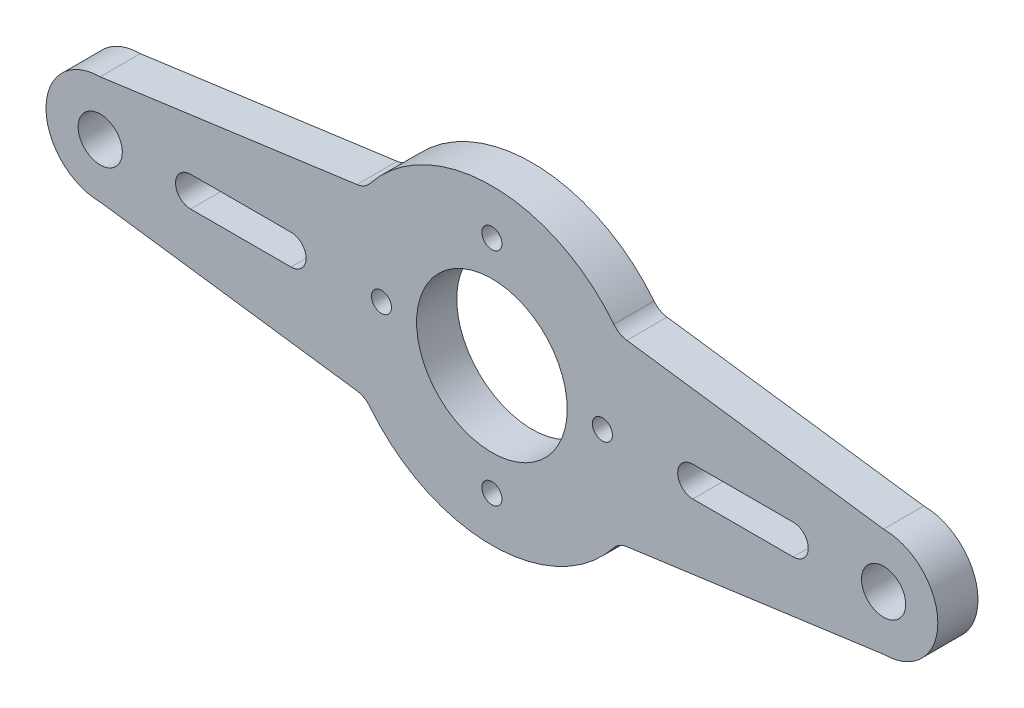
ISO-10303-21;
HEADER;
FILE_DESCRIPTION(('STEP AP214'),'2;1');
FILE_NAME('part.step','',(''),(''),'','','');
FILE_SCHEMA(('AUTOMOTIVE_DESIGN { 1 0 10303 214 1 1 1 1 }'));
ENDSEC;
DATA;
#1=APPLICATION_CONTEXT('core data for automotive mechanical design processes');
#2=APPLICATION_PROTOCOL_DEFINITION('international standard','automotive_design',2000,#1);
#3=PRODUCT_CONTEXT('',#1,'mechanical');
#4=PRODUCT('Part','Part','',(#3));
#5=PRODUCT_RELATED_PRODUCT_CATEGORY('part','',(#4));
#6=PRODUCT_DEFINITION_FORMATION('','',#4);
#7=PRODUCT_DEFINITION_CONTEXT('part definition',#1,'design');
#8=PRODUCT_DEFINITION('design','',#6,#7);
#9=PRODUCT_DEFINITION_SHAPE('','',#8);
#10=(LENGTH_UNIT() NAMED_UNIT(*) SI_UNIT(.MILLI.,.METRE.));
#11=(NAMED_UNIT(*) PLANE_ANGLE_UNIT() SI_UNIT($,.RADIAN.));
#12=(NAMED_UNIT(*) SI_UNIT($,.STERADIAN.) SOLID_ANGLE_UNIT());
#13=UNCERTAINTY_MEASURE_WITH_UNIT(LENGTH_MEASURE(1.E-05),#10,'distance_accuracy_value','');
#14=(GEOMETRIC_REPRESENTATION_CONTEXT(3) GLOBAL_UNCERTAINTY_ASSIGNED_CONTEXT((#13)) GLOBAL_UNIT_ASSIGNED_CONTEXT((#10,
#11,#12)) REPRESENTATION_CONTEXT('',''));
#15=CARTESIAN_POINT('',(0.,0.,0.));
#16=DIRECTION('',(0.,0.,1.));
#17=DIRECTION('',(1.,0.,0.));
#18=AXIS2_PLACEMENT_3D('',#15,#16,#17);
#19=CARTESIAN_POINT('',(-19.5,0.,2.));
#20=DIRECTION('',(0.,0.,1.));
#21=DIRECTION('',(1.,0.,0.));
#22=AXIS2_PLACEMENT_3D('',#19,#20,#21);
#23=PLANE('',#22);
#24=CARTESIAN_POINT('',(0.,5.5,2.));
#25=DIRECTION('',(0.,0.,1.));
#26=DIRECTION('',(1.,0.,0.));
#27=AXIS2_PLACEMENT_3D('',#24,#25,#26);
#28=CIRCLE('',#27,0.5);
#29=CARTESIAN_POINT('',(0.5,5.5,2.));
#30=VERTEX_POINT('',#29);
#31=EDGE_CURVE('E699',#30,#30,#28,.T.);
#32=ORIENTED_EDGE('',*,*,#31,.F.);
#33=EDGE_LOOP('',(#32));
#34=FACE_BOUND('',#33,.T.);
#35=CARTESIAN_POINT('',(5.5,0.,2.));
#36=DIRECTION('',(0.,0.,1.));
#37=DIRECTION('',(1.,0.,0.));
#38=AXIS2_PLACEMENT_3D('',#35,#36,#37);
#39=CIRCLE('',#38,0.5);
#40=CARTESIAN_POINT('',(6.,0.,2.));
#41=VERTEX_POINT('',#40);
#42=EDGE_CURVE('E693',#41,#41,#39,.T.);
#43=ORIENTED_EDGE('',*,*,#42,.F.);
#44=EDGE_LOOP('',(#43));
#45=FACE_BOUND('',#44,.T.);
#46=CARTESIAN_POINT('',(0.,-5.5,2.));
#47=DIRECTION('',(0.,0.,1.));
#48=DIRECTION('',(1.,0.,0.));
#49=AXIS2_PLACEMENT_3D('',#46,#47,#48);
#50=CIRCLE('',#49,0.5);
#51=CARTESIAN_POINT('',(0.5,-5.5,2.));
#52=VERTEX_POINT('',#51);
#53=EDGE_CURVE('E687',#52,#52,#50,.T.);
#54=ORIENTED_EDGE('',*,*,#53,.F.);
#55=EDGE_LOOP('',(#54));
#56=FACE_BOUND('',#55,.T.);
#57=CARTESIAN_POINT('',(-5.5,0.,2.));
#58=DIRECTION('',(0.,0.,1.));
#59=DIRECTION('',(1.,0.,0.));
#60=AXIS2_PLACEMENT_3D('',#57,#58,#59);
#61=CIRCLE('',#60,0.5);
#62=CARTESIAN_POINT('',(-5.,0.,2.));
#63=VERTEX_POINT('',#62);
#64=EDGE_CURVE('E674',#63,#63,#61,.T.);
#65=ORIENTED_EDGE('',*,*,#64,.F.);
#66=EDGE_LOOP('',(#65));
#67=FACE_BOUND('',#66,.T.);
#68=CARTESIAN_POINT('',(19.5,0.,2.));
#69=DIRECTION('',(0.,0.,1.));
#70=DIRECTION('',(-1.,0.,0.));
#71=AXIS2_PLACEMENT_3D('',#68,#69,#70);
#72=CIRCLE('',#71,1.1);
#73=CARTESIAN_POINT('',(18.4,0.,2.));
#74=VERTEX_POINT('',#73);
#75=EDGE_CURVE('E215',#74,#74,#72,.T.);
#76=ORIENTED_EDGE('',*,*,#75,.F.);
#77=EDGE_LOOP('',(#76));
#78=FACE_BOUND('',#77,.T.);
#79=CARTESIAN_POINT('',(-19.5,0.,2.));
#80=DIRECTION('',(0.,0.,1.));
#81=DIRECTION('',(1.,0.,0.));
#82=AXIS2_PLACEMENT_3D('',#79,#80,#81);
#83=CIRCLE('',#82,2.7);
#84=CARTESIAN_POINT('',(-19.5,2.7,2.));
#85=VERTEX_POINT('',#84);
#86=CARTESIAN_POINT('',(-19.5,-2.7,2.));
#87=VERTEX_POINT('',#86);
#88=EDGE_CURVE('E263',#85,#87,#83,.T.);
#89=ORIENTED_EDGE('',*,*,#88,.T.);
#90=DIRECTION('',(0.990771512217223,-0.135542652249383,0.));
#91=VECTOR('',#90,1.);
#92=CARTESIAN_POINT('',(-19.5,-2.7,2.));
#93=LINE('',#92,#91);
#94=CARTESIAN_POINT('',(-6.71834513514588,-4.44859630011115,2.));
#95=VERTEX_POINT('',#94);
#96=EDGE_CURVE('E266',#87,#95,#93,.T.);
#97=ORIENTED_EDGE('',*,*,#96,.T.);
#98=CARTESIAN_POINT('',(-6.85388778739526,-5.43936781232837,2.));
#99=DIRECTION('',(0.,0.,1.));
#100=DIRECTION('',(1.,0.,0.));
#101=AXIS2_PLACEMENT_3D('',#98,#99,#100);
#102=CIRCLE('',#101,1.);
#103=CARTESIAN_POINT('',(-6.07058632597866,-4.8177257766337,2.));
#104=VERTEX_POINT('',#103);
#105=EDGE_CURVE('E339',#95,#104,#102,.F.);
#106=ORIENTED_EDGE('',*,*,#105,.T.);
#107=CARTESIAN_POINT('',(0.,0.,2.));
#108=DIRECTION('',(0.,0.,1.));
#109=DIRECTION('',(1.,0.,0.));
#110=AXIS2_PLACEMENT_3D('',#107,#108,#109);
#111=CIRCLE('',#110,7.74999999999999);
#112=CARTESIAN_POINT('',(6.07058632597867,-4.8177257766337,2.));
#113=VERTEX_POINT('',#112);
#114=EDGE_CURVE('E270',#104,#113,#111,.T.);
#115=ORIENTED_EDGE('',*,*,#114,.T.);
#116=CARTESIAN_POINT('',(6.85388778739527,-5.43936781232837,2.));
#117=DIRECTION('',(0.,0.,1.));
#118=DIRECTION('',(1.,0.,0.));
#119=AXIS2_PLACEMENT_3D('',#116,#117,#118);
#120=CIRCLE('',#119,1.);
#121=CARTESIAN_POINT('',(6.71834513514589,-4.44859630011114,2.));
#122=VERTEX_POINT('',#121);
#123=EDGE_CURVE('E343',#113,#122,#120,.F.);
#124=ORIENTED_EDGE('',*,*,#123,.T.);
#125=DIRECTION('',(0.990771512217223,0.135542652249383,0.));
#126=VECTOR('',#125,1.);
#127=CARTESIAN_POINT('',(19.5,-2.7,2.));
#128=LINE('',#127,#126);
#129=CARTESIAN_POINT('',(19.5,-2.69999999999999,2.));
#130=VERTEX_POINT('',#129);
#131=EDGE_CURVE('E273',#122,#130,#128,.T.);
#132=ORIENTED_EDGE('',*,*,#131,.T.);
#133=CARTESIAN_POINT('',(19.5,0.,2.));
#134=DIRECTION('',(0.,0.,1.));
#135=DIRECTION('',(-1.,0.,0.));
#136=AXIS2_PLACEMENT_3D('',#133,#134,#135);
#137=CIRCLE('',#136,2.7);
#138=CARTESIAN_POINT('',(19.5,2.7,2.));
#139=VERTEX_POINT('',#138);
#140=EDGE_CURVE('E275',#130,#139,#137,.T.);
#141=ORIENTED_EDGE('',*,*,#140,.T.);
#142=DIRECTION('',(-0.990771512217223,0.135542652249384,0.));
#143=VECTOR('',#142,1.);
#144=CARTESIAN_POINT('',(19.5,2.7,2.));
#145=LINE('',#144,#143);
#146=CARTESIAN_POINT('',(6.71834513514589,4.44859630011115,2.));
#147=VERTEX_POINT('',#146);
#148=EDGE_CURVE('E277',#139,#147,#145,.T.);
#149=ORIENTED_EDGE('',*,*,#148,.T.);
#150=CARTESIAN_POINT('',(6.85388778739527,5.43936781232837,2.));
#151=DIRECTION('',(0.,0.,1.));
#152=DIRECTION('',(1.,0.,0.));
#153=AXIS2_PLACEMENT_3D('',#150,#151,#152);
#154=CIRCLE('',#153,1.);
#155=CARTESIAN_POINT('',(6.07058632597866,4.8177257766337,2.));
#156=VERTEX_POINT('',#155);
#157=EDGE_CURVE('E13',#147,#156,#154,.F.);
#158=ORIENTED_EDGE('',*,*,#157,.T.);
#159=CARTESIAN_POINT('',(0.,0.,2.));
#160=DIRECTION('',(0.,0.,1.));
#161=DIRECTION('',(1.,0.,0.));
#162=AXIS2_PLACEMENT_3D('',#159,#160,#161);
#163=CIRCLE('',#162,7.75);
#164=CARTESIAN_POINT('',(-6.07058632597866,4.81772577663371,2.));
#165=VERTEX_POINT('',#164);
#166=EDGE_CURVE('E279',#156,#165,#163,.T.);
#167=ORIENTED_EDGE('',*,*,#166,.T.);
#168=CARTESIAN_POINT('',(-6.85388778739526,5.43936781232838,2.));
#169=DIRECTION('',(0.,0.,1.));
#170=DIRECTION('',(1.,0.,0.));
#171=AXIS2_PLACEMENT_3D('',#168,#169,#170);
#172=CIRCLE('',#171,1.);
#173=CARTESIAN_POINT('',(-6.71834513514588,4.44859630011115,2.));
#174=VERTEX_POINT('',#173);
#175=EDGE_CURVE('E335',#165,#174,#172,.F.);
#176=ORIENTED_EDGE('',*,*,#175,.T.);
#177=DIRECTION('',(-0.990771512217223,-0.135542652249384,0.));
#178=VECTOR('',#177,1.);
#179=CARTESIAN_POINT('',(-19.5,2.7,2.));
#180=LINE('',#179,#178);
#181=EDGE_CURVE('E282',#174,#85,#180,.T.);
#182=ORIENTED_EDGE('',*,*,#181,.T.);
#183=EDGE_LOOP('',(#89,#97,#106,#115,#124,#132,#141,#149,#158,#167,#176,#182));
#184=FACE_BOUND('',#183,.T.);
#185=CARTESIAN_POINT('',(-19.5,0.,2.));
#186=DIRECTION('',(0.,0.,1.));
#187=DIRECTION('',(1.,0.,0.));
#188=AXIS2_PLACEMENT_3D('',#185,#186,#187);
#189=CIRCLE('',#188,1.1);
#190=CARTESIAN_POINT('',(-18.4,0.,2.));
#191=VERTEX_POINT('',#190);
#192=EDGE_CURVE('E257',#191,#191,#189,.T.);
#193=ORIENTED_EDGE('',*,*,#192,.F.);
#194=EDGE_LOOP('',(#193));
#195=FACE_BOUND('',#194,.T.);
#196=DIRECTION('',(-1.,0.,0.));
#197=VECTOR('',#196,1.);
#198=CARTESIAN_POINT('',(-10.,0.749999999999999,2.));
#199=LINE('',#198,#197);
#200=CARTESIAN_POINT('',(-10.,0.749999999999999,2.));
#201=VERTEX_POINT('',#200);
#202=CARTESIAN_POINT('',(-15.,0.75,2.));
#203=VERTEX_POINT('',#202);
#204=EDGE_CURVE('E228',#201,#203,#199,.T.);
#205=ORIENTED_EDGE('',*,*,#204,.F.);
#206=CARTESIAN_POINT('',(-10.,0.,2.));
#207=DIRECTION('',(0.,0.,1.));
#208=DIRECTION('',(1.,0.,0.));
#209=AXIS2_PLACEMENT_3D('',#206,#207,#208);
#210=CIRCLE('',#209,0.75);
#211=CARTESIAN_POINT('',(-10.,-0.750000000000001,2.));
#212=VERTEX_POINT('',#211);
#213=EDGE_CURVE('E226',#212,#201,#210,.T.);
#214=ORIENTED_EDGE('',*,*,#213,.F.);
#215=DIRECTION('',(1.,0.,0.));
#216=VECTOR('',#215,1.);
#217=CARTESIAN_POINT('',(-10.,-0.750000000000001,2.));
#218=LINE('',#217,#216);
#219=CARTESIAN_POINT('',(-15.,-0.750000000000001,2.));
#220=VERTEX_POINT('',#219);
#221=EDGE_CURVE('E234',#220,#212,#218,.T.);
#222=ORIENTED_EDGE('',*,*,#221,.F.);
#223=CARTESIAN_POINT('',(-15.,0.,2.));
#224=DIRECTION('',(0.,0.,1.));
#225=DIRECTION('',(1.,0.,0.));
#226=AXIS2_PLACEMENT_3D('',#223,#224,#225);
#227=CIRCLE('',#226,0.75);
#228=EDGE_CURVE('E231',#203,#220,#227,.T.);
#229=ORIENTED_EDGE('',*,*,#228,.F.);
#230=EDGE_LOOP('',(#205,#214,#222,#229));
#231=FACE_BOUND('',#230,.T.);
#232=DIRECTION('',(1.,0.,0.));
#233=VECTOR('',#232,1.);
#234=CARTESIAN_POINT('',(10.,-0.750000000000001,2.));
#235=LINE('',#234,#233);
#236=CARTESIAN_POINT('',(10.,-0.750000000000001,2.));
#237=VERTEX_POINT('',#236);
#238=CARTESIAN_POINT('',(15.,-0.75,2.));
#239=VERTEX_POINT('',#238);
#240=EDGE_CURVE('E192',#237,#239,#235,.T.);
#241=ORIENTED_EDGE('',*,*,#240,.F.);
#242=CARTESIAN_POINT('',(10.,0.,2.));
#243=DIRECTION('',(0.,0.,1.));
#244=DIRECTION('',(-1.,0.,0.));
#245=AXIS2_PLACEMENT_3D('',#242,#243,#244);
#246=CIRCLE('',#245,0.75);
#247=CARTESIAN_POINT('',(10.,0.749999999999998,2.));
#248=VERTEX_POINT('',#247);
#249=EDGE_CURVE('E182',#248,#237,#246,.T.);
#250=ORIENTED_EDGE('',*,*,#249,.F.);
#251=DIRECTION('',(-1.,0.,0.));
#252=VECTOR('',#251,1.);
#253=CARTESIAN_POINT('',(10.,0.749999999999998,2.));
#254=LINE('',#253,#252);
#255=CARTESIAN_POINT('',(15.,0.749999999999999,2.));
#256=VERTEX_POINT('',#255);
#257=EDGE_CURVE('E208',#256,#248,#254,.T.);
#258=ORIENTED_EDGE('',*,*,#257,.F.);
#259=CARTESIAN_POINT('',(15.,0.,2.));
#260=DIRECTION('',(0.,0.,1.));
#261=DIRECTION('',(-1.,0.,0.));
#262=AXIS2_PLACEMENT_3D('',#259,#260,#261);
#263=CIRCLE('',#262,0.75);
#264=EDGE_CURVE('E206',#239,#256,#263,.T.);
#265=ORIENTED_EDGE('',*,*,#264,.F.);
#266=EDGE_LOOP('',(#241,#250,#258,#265));
#267=FACE_BOUND('',#266,.T.);
#268=CARTESIAN_POINT('',(0.,0.,2.));
#269=DIRECTION('',(0.,0.,1.));
#270=DIRECTION('',(1.,0.,0.));
#271=AXIS2_PLACEMENT_3D('',#268,#269,#270);
#272=CIRCLE('',#271,3.75);
#273=CARTESIAN_POINT('',(3.75,0.,2.));
#274=VERTEX_POINT('',#273);
#275=EDGE_CURVE('E668',#274,#274,#272,.T.);
#276=ORIENTED_EDGE('',*,*,#275,.F.);
#277=EDGE_LOOP('',(#276));
#278=FACE_BOUND('',#277,.T.);
#279=ADVANCED_FACE('F44',(#34,#45,#56,#67,#78,#184,#195,#231,#267,#278),#23,.T.);
#280=CARTESIAN_POINT('',(-19.5,0.,0.));
#281=DIRECTION('',(0.,0.,1.));
#282=DIRECTION('',(1.,0.,0.));
#283=AXIS2_PLACEMENT_3D('',#280,#281,#282);
#284=PLANE('',#283);
#285=CARTESIAN_POINT('',(0.,5.5,0.));
#286=DIRECTION('',(0.,0.,1.));
#287=DIRECTION('',(1.,0.,0.));
#288=AXIS2_PLACEMENT_3D('',#285,#286,#287);
#289=CIRCLE('',#288,0.5);
#290=CARTESIAN_POINT('',(0.5,5.5,0.));
#291=VERTEX_POINT('',#290);
#292=EDGE_CURVE('E696',#291,#291,#289,.T.);
#293=ORIENTED_EDGE('',*,*,#292,.T.);
#294=EDGE_LOOP('',(#293));
#295=FACE_BOUND('',#294,.T.);
#296=CARTESIAN_POINT('',(5.5,0.,0.));
#297=DIRECTION('',(0.,0.,1.));
#298=DIRECTION('',(1.,0.,0.));
#299=AXIS2_PLACEMENT_3D('',#296,#297,#298);
#300=CIRCLE('',#299,0.5);
#301=CARTESIAN_POINT('',(6.,0.,0.));
#302=VERTEX_POINT('',#301);
#303=EDGE_CURVE('E690',#302,#302,#300,.T.);
#304=ORIENTED_EDGE('',*,*,#303,.T.);
#305=EDGE_LOOP('',(#304));
#306=FACE_BOUND('',#305,.T.);
#307=CARTESIAN_POINT('',(0.,-5.5,0.));
#308=DIRECTION('',(0.,0.,1.));
#309=DIRECTION('',(1.,0.,0.));
#310=AXIS2_PLACEMENT_3D('',#307,#308,#309);
#311=CIRCLE('',#310,0.5);
#312=CARTESIAN_POINT('',(0.5,-5.5,0.));
#313=VERTEX_POINT('',#312);
#314=EDGE_CURVE('E684',#313,#313,#311,.T.);
#315=ORIENTED_EDGE('',*,*,#314,.T.);
#316=EDGE_LOOP('',(#315));
#317=FACE_BOUND('',#316,.T.);
#318=CARTESIAN_POINT('',(-5.5,0.,0.));
#319=DIRECTION('',(0.,0.,1.));
#320=DIRECTION('',(1.,0.,0.));
#321=AXIS2_PLACEMENT_3D('',#318,#319,#320);
#322=CIRCLE('',#321,0.5);
#323=CARTESIAN_POINT('',(-5.,0.,0.));
#324=VERTEX_POINT('',#323);
#325=EDGE_CURVE('E669',#324,#324,#322,.T.);
#326=ORIENTED_EDGE('',*,*,#325,.T.);
#327=EDGE_LOOP('',(#326));
#328=FACE_BOUND('',#327,.T.);
#329=CARTESIAN_POINT('',(-10.,0.,0.));
#330=DIRECTION('',(0.,0.,1.));
#331=DIRECTION('',(1.,0.,0.));
#332=AXIS2_PLACEMENT_3D('',#329,#330,#331);
#333=CIRCLE('',#332,0.75);
#334=CARTESIAN_POINT('',(-10.,-0.750000000000001,0.));
#335=VERTEX_POINT('',#334);
#336=CARTESIAN_POINT('',(-10.,0.749999999999999,0.));
#337=VERTEX_POINT('',#336);
#338=EDGE_CURVE('E200',#335,#337,#333,.T.);
#339=ORIENTED_EDGE('',*,*,#338,.T.);
#340=DIRECTION('',(-1.,0.,0.));
#341=VECTOR('',#340,1.);
#342=CARTESIAN_POINT('',(-10.,0.749999999999999,0.));
#343=LINE('',#342,#341);
#344=CARTESIAN_POINT('',(-15.,0.75,0.));
#345=VERTEX_POINT('',#344);
#346=EDGE_CURVE('E239',#337,#345,#343,.T.);
#347=ORIENTED_EDGE('',*,*,#346,.T.);
#348=CARTESIAN_POINT('',(-15.,0.,0.));
#349=DIRECTION('',(0.,0.,1.));
#350=DIRECTION('',(1.,0.,0.));
#351=AXIS2_PLACEMENT_3D('',#348,#349,#350);
#352=CIRCLE('',#351,0.75);
#353=CARTESIAN_POINT('',(-15.,-0.750000000000001,0.));
#354=VERTEX_POINT('',#353);
#355=EDGE_CURVE('E242',#345,#354,#352,.T.);
#356=ORIENTED_EDGE('',*,*,#355,.T.);
#357=DIRECTION('',(1.,0.,0.));
#358=VECTOR('',#357,1.);
#359=CARTESIAN_POINT('',(-10.,-0.750000000000001,0.));
#360=LINE('',#359,#358);
#361=EDGE_CURVE('E229',#354,#335,#360,.T.);
#362=ORIENTED_EDGE('',*,*,#361,.T.);
#363=EDGE_LOOP('',(#339,#347,#356,#362));
#364=FACE_BOUND('',#363,.T.);
#365=CARTESIAN_POINT('',(-19.5,0.,0.));
#366=DIRECTION('',(0.,0.,1.));
#367=DIRECTION('',(1.,0.,0.));
#368=AXIS2_PLACEMENT_3D('',#365,#366,#367);
#369=CIRCLE('',#368,2.7);
#370=CARTESIAN_POINT('',(-19.5,2.7,0.));
#371=VERTEX_POINT('',#370);
#372=CARTESIAN_POINT('',(-19.5,-2.7,0.));
#373=VERTEX_POINT('',#372);
#374=EDGE_CURVE('E260',#371,#373,#369,.T.);
#375=ORIENTED_EDGE('',*,*,#374,.F.);
#376=DIRECTION('',(-0.990771512217223,-0.135542652249384,0.));
#377=VECTOR('',#376,1.);
#378=CARTESIAN_POINT('',(-19.5,2.7,0.));
#379=LINE('',#378,#377);
#380=CARTESIAN_POINT('',(-6.71834513514588,4.44859630011115,0.));
#381=VERTEX_POINT('',#380);
#382=EDGE_CURVE('E267',#381,#371,#379,.T.);
#383=ORIENTED_EDGE('',*,*,#382,.F.);
#384=CARTESIAN_POINT('',(-6.85388778739526,5.43936781232838,0.));
#385=DIRECTION('',(0.,0.,1.));
#386=DIRECTION('',(1.,0.,0.));
#387=AXIS2_PLACEMENT_3D('',#384,#385,#386);
#388=CIRCLE('',#387,1.);
#389=CARTESIAN_POINT('',(-6.07058632597866,4.81772577663371,0.));
#390=VERTEX_POINT('',#389);
#391=EDGE_CURVE('E333',#381,#390,#388,.T.);
#392=ORIENTED_EDGE('',*,*,#391,.T.);
#393=CARTESIAN_POINT('',(0.,0.,0.));
#394=DIRECTION('',(0.,0.,1.));
#395=DIRECTION('',(1.,0.,0.));
#396=AXIS2_PLACEMENT_3D('',#393,#394,#395);
#397=CIRCLE('',#396,7.75);
#398=CARTESIAN_POINT('',(6.07058632597866,4.8177257766337,0.));
#399=VERTEX_POINT('',#398);
#400=EDGE_CURVE('E299',#399,#390,#397,.T.);
#401=ORIENTED_EDGE('',*,*,#400,.F.);
#402=CARTESIAN_POINT('',(6.85388778739527,5.43936781232837,0.));
#403=DIRECTION('',(0.,0.,1.));
#404=DIRECTION('',(1.,0.,0.));
#405=AXIS2_PLACEMENT_3D('',#402,#403,#404);
#406=CIRCLE('',#405,1.);
#407=CARTESIAN_POINT('',(6.71834513514589,4.44859630011115,0.));
#408=VERTEX_POINT('',#407);
#409=EDGE_CURVE('E52',#399,#408,#406,.T.);
#410=ORIENTED_EDGE('',*,*,#409,.T.);
#411=DIRECTION('',(-0.990771512217223,0.135542652249384,0.));
#412=VECTOR('',#411,1.);
#413=CARTESIAN_POINT('',(19.5,2.7,0.));
#414=LINE('',#413,#412);
#415=CARTESIAN_POINT('',(19.5,2.7,0.));
#416=VERTEX_POINT('',#415);
#417=EDGE_CURVE('E297',#416,#408,#414,.T.);
#418=ORIENTED_EDGE('',*,*,#417,.F.);
#419=CARTESIAN_POINT('',(19.5,0.,0.));
#420=DIRECTION('',(0.,0.,1.));
#421=DIRECTION('',(-1.,0.,0.));
#422=AXIS2_PLACEMENT_3D('',#419,#420,#421);
#423=CIRCLE('',#422,2.7);
#424=CARTESIAN_POINT('',(19.5,-2.69999999999999,0.));
#425=VERTEX_POINT('',#424);
#426=EDGE_CURVE('E295',#425,#416,#423,.T.);
#427=ORIENTED_EDGE('',*,*,#426,.F.);
#428=DIRECTION('',(0.990771512217223,0.135542652249383,0.));
#429=VECTOR('',#428,1.);
#430=CARTESIAN_POINT('',(19.5,-2.7,0.));
#431=LINE('',#430,#429);
#432=CARTESIAN_POINT('',(6.71834513514589,-4.44859630011114,0.));
#433=VERTEX_POINT('',#432);
#434=EDGE_CURVE('E293',#433,#425,#431,.T.);
#435=ORIENTED_EDGE('',*,*,#434,.F.);
#436=CARTESIAN_POINT('',(6.85388778739527,-5.43936781232837,0.));
#437=DIRECTION('',(0.,0.,1.));
#438=DIRECTION('',(1.,0.,0.));
#439=AXIS2_PLACEMENT_3D('',#436,#437,#438);
#440=CIRCLE('',#439,1.);
#441=CARTESIAN_POINT('',(6.07058632597867,-4.8177257766337,0.));
#442=VERTEX_POINT('',#441);
#443=EDGE_CURVE('E341',#433,#442,#440,.T.);
#444=ORIENTED_EDGE('',*,*,#443,.T.);
#445=CARTESIAN_POINT('',(0.,0.,0.));
#446=DIRECTION('',(0.,0.,1.));
#447=DIRECTION('',(1.,0.,0.));
#448=AXIS2_PLACEMENT_3D('',#445,#446,#447);
#449=CIRCLE('',#448,7.74999999999999);
#450=CARTESIAN_POINT('',(-6.07058632597866,-4.8177257766337,0.));
#451=VERTEX_POINT('',#450);
#452=EDGE_CURVE('E290',#451,#442,#449,.T.);
#453=ORIENTED_EDGE('',*,*,#452,.F.);
#454=CARTESIAN_POINT('',(-6.85388778739526,-5.43936781232837,0.));
#455=DIRECTION('',(0.,0.,1.));
#456=DIRECTION('',(1.,0.,0.));
#457=AXIS2_PLACEMENT_3D('',#454,#455,#456);
#458=CIRCLE('',#457,1.);
#459=CARTESIAN_POINT('',(-6.71834513514588,-4.44859630011115,0.));
#460=VERTEX_POINT('',#459);
#461=EDGE_CURVE('E337',#451,#460,#458,.T.);
#462=ORIENTED_EDGE('',*,*,#461,.T.);
#463=DIRECTION('',(0.990771512217223,-0.135542652249383,0.));
#464=VECTOR('',#463,1.);
#465=CARTESIAN_POINT('',(-19.5,-2.7,0.));
#466=LINE('',#465,#464);
#467=EDGE_CURVE('E287',#373,#460,#466,.T.);
#468=ORIENTED_EDGE('',*,*,#467,.F.);
#469=EDGE_LOOP('',(#375,#383,#392,#401,#410,#418,#427,#435,#444,#453,#462,#468));
#470=FACE_BOUND('',#469,.T.);
#471=CARTESIAN_POINT('',(-19.5,0.,0.));
#472=DIRECTION('',(0.,0.,1.));
#473=DIRECTION('',(1.,0.,0.));
#474=AXIS2_PLACEMENT_3D('',#471,#472,#473);
#475=CIRCLE('',#474,1.1);
#476=CARTESIAN_POINT('',(-18.4,0.,0.));
#477=VERTEX_POINT('',#476);
#478=EDGE_CURVE('E256',#477,#477,#475,.T.);
#479=ORIENTED_EDGE('',*,*,#478,.T.);
#480=EDGE_LOOP('',(#479));
#481=FACE_BOUND('',#480,.T.);
#482=CARTESIAN_POINT('',(10.,0.,0.));
#483=DIRECTION('',(0.,0.,1.));
#484=DIRECTION('',(-1.,0.,0.));
#485=AXIS2_PLACEMENT_3D('',#482,#483,#484);
#486=CIRCLE('',#485,0.75);
#487=CARTESIAN_POINT('',(10.,0.749999999999998,0.));
#488=VERTEX_POINT('',#487);
#489=CARTESIAN_POINT('',(10.,-0.750000000000001,0.));
#490=VERTEX_POINT('',#489);
#491=EDGE_CURVE('E213',#488,#490,#486,.T.);
#492=ORIENTED_EDGE('',*,*,#491,.T.);
#493=DIRECTION('',(1.,0.,0.));
#494=VECTOR('',#493,1.);
#495=CARTESIAN_POINT('',(10.,-0.750000000000001,0.));
#496=LINE('',#495,#494);
#497=CARTESIAN_POINT('',(15.,-0.75,0.));
#498=VERTEX_POINT('',#497);
#499=EDGE_CURVE('E199',#490,#498,#496,.T.);
#500=ORIENTED_EDGE('',*,*,#499,.T.);
#501=CARTESIAN_POINT('',(15.,0.,0.));
#502=DIRECTION('',(0.,0.,1.));
#503=DIRECTION('',(-1.,0.,0.));
#504=AXIS2_PLACEMENT_3D('',#501,#502,#503);
#505=CIRCLE('',#504,0.75);
#506=CARTESIAN_POINT('',(15.,0.749999999999999,0.));
#507=VERTEX_POINT('',#506);
#508=EDGE_CURVE('E217',#498,#507,#505,.T.);
#509=ORIENTED_EDGE('',*,*,#508,.T.);
#510=DIRECTION('',(-1.,0.,0.));
#511=VECTOR('',#510,1.);
#512=CARTESIAN_POINT('',(10.,0.749999999999998,0.));
#513=LINE('',#512,#511);
#514=EDGE_CURVE('E193',#507,#488,#513,.T.);
#515=ORIENTED_EDGE('',*,*,#514,.T.);
#516=EDGE_LOOP('',(#492,#500,#509,#515));
#517=FACE_BOUND('',#516,.T.);
#518=CARTESIAN_POINT('',(19.5,0.,0.));
#519=DIRECTION('',(0.,0.,1.));
#520=DIRECTION('',(-1.,0.,0.));
#521=AXIS2_PLACEMENT_3D('',#518,#519,#520);
#522=CIRCLE('',#521,1.1);
#523=CARTESIAN_POINT('',(18.4,0.,0.));
#524=VERTEX_POINT('',#523);
#525=EDGE_CURVE('E663',#524,#524,#522,.T.);
#526=ORIENTED_EDGE('',*,*,#525,.T.);
#527=EDGE_LOOP('',(#526));
#528=FACE_BOUND('',#527,.T.);
#529=CARTESIAN_POINT('',(0.,0.,0.));
#530=DIRECTION('',(0.,0.,1.));
#531=DIRECTION('',(1.,0.,0.));
#532=AXIS2_PLACEMENT_3D('',#529,#530,#531);
#533=CIRCLE('',#532,3.75);
#534=CARTESIAN_POINT('',(3.75,0.,0.));
#535=VERTEX_POINT('',#534);
#536=EDGE_CURVE('E666',#535,#535,#533,.T.);
#537=ORIENTED_EDGE('',*,*,#536,.T.);
#538=EDGE_LOOP('',(#537));
#539=FACE_BOUND('',#538,.T.);
#540=ADVANCED_FACE('F360',(#295,#306,#317,#328,#364,#470,#481,#517,#528,#539),#284,.F.);
#541=CARTESIAN_POINT('',(-19.5,0.,2.));
#542=DIRECTION('',(0.,0.,-1.));
#543=DIRECTION('',(-1.,0.,0.));
#544=AXIS2_PLACEMENT_3D('',#541,#542,#543);
#545=CYLINDRICAL_SURFACE('',#544,2.7);
#546=ORIENTED_EDGE('',*,*,#374,.T.);
#547=DIRECTION('',(0.,0.,-1.));
#548=VECTOR('',#547,1.);
#549=CARTESIAN_POINT('',(-19.5,-2.7,2.));
#550=LINE('',#549,#548);
#551=EDGE_CURVE('E311',#87,#373,#550,.T.);
#552=ORIENTED_EDGE('',*,*,#551,.F.);
#553=ORIENTED_EDGE('',*,*,#88,.F.);
#554=DIRECTION('',(0.,0.,-1.));
#555=VECTOR('',#554,1.);
#556=CARTESIAN_POINT('',(-19.5,2.7,2.));
#557=LINE('',#556,#555);
#558=EDGE_CURVE('E284',#85,#371,#557,.T.);
#559=ORIENTED_EDGE('',*,*,#558,.T.);
#560=EDGE_LOOP('',(#546,#552,#553,#559));
#561=FACE_BOUND('',#560,.T.);
#562=ADVANCED_FACE('F375',(#561),#545,.T.);
#563=CARTESIAN_POINT('',(-19.5,-2.7,2.));
#564=DIRECTION('',(0.135542652249383,0.990771512217223,0.));
#565=DIRECTION('',(-0.990771512217223,0.135542652249383,0.));
#566=AXIS2_PLACEMENT_3D('',#563,#564,#565);
#567=PLANE('',#566);
#568=ORIENTED_EDGE('',*,*,#467,.T.);
#569=DIRECTION('',(0.,0.,1.));
#570=VECTOR('',#569,1.);
#571=CARTESIAN_POINT('',(-6.71834513514588,-4.44859630011115,2.));
#572=LINE('',#571,#570);
#573=EDGE_CURVE('E327',#460,#95,#572,.T.);
#574=ORIENTED_EDGE('',*,*,#573,.T.);
#575=ORIENTED_EDGE('',*,*,#96,.F.);
#576=ORIENTED_EDGE('',*,*,#551,.T.);
#577=EDGE_LOOP('',(#568,#574,#575,#576));
#578=FACE_BOUND('',#577,.T.);
#579=ADVANCED_FACE('F371',(#578),#567,.F.);
#580=CARTESIAN_POINT('',(0.,0.,2.));
#581=DIRECTION('',(0.,0.,-1.));
#582=DIRECTION('',(-1.,0.,0.));
#583=AXIS2_PLACEMENT_3D('',#580,#581,#582);
#584=CYLINDRICAL_SURFACE('',#583,7.74999999999999);
#585=ORIENTED_EDGE('',*,*,#114,.F.);
#586=DIRECTION('',(0.,0.,-1.));
#587=VECTOR('',#586,1.);
#588=CARTESIAN_POINT('',(-6.07058632597866,-4.8177257766337,2.));
#589=LINE('',#588,#587);
#590=EDGE_CURVE('E324',#104,#451,#589,.T.);
#591=ORIENTED_EDGE('',*,*,#590,.T.);
#592=ORIENTED_EDGE('',*,*,#452,.T.);
#593=DIRECTION('',(0.,0.,-1.));
#594=VECTOR('',#593,1.);
#595=CARTESIAN_POINT('',(6.07058632597867,-4.8177257766337,2.));
#596=LINE('',#595,#594);
#597=EDGE_CURVE('E322',#442,#113,#596,.F.);
#598=ORIENTED_EDGE('',*,*,#597,.T.);
#599=EDGE_LOOP('',(#585,#591,#592,#598));
#600=FACE_BOUND('',#599,.T.);
#601=ADVANCED_FACE('F364',(#600),#584,.T.);
#602=CARTESIAN_POINT('',(19.5,-2.7,2.));
#603=DIRECTION('',(-0.135542652249383,0.990771512217223,0.));
#604=DIRECTION('',(-0.990771512217223,-0.135542652249383,0.));
#605=AXIS2_PLACEMENT_3D('',#602,#603,#604);
#606=PLANE('',#605);
#607=ORIENTED_EDGE('',*,*,#131,.F.);
#608=DIRECTION('',(0.,0.,1.));
#609=VECTOR('',#608,1.);
#610=CARTESIAN_POINT('',(6.71834513514588,-4.44859630011115,0.));
#611=LINE('',#610,#609);
#612=EDGE_CURVE('E329',#122,#433,#611,.F.);
#613=ORIENTED_EDGE('',*,*,#612,.T.);
#614=ORIENTED_EDGE('',*,*,#434,.T.);
#615=DIRECTION('',(0.,0.,-1.));
#616=VECTOR('',#615,1.);
#617=CARTESIAN_POINT('',(19.5,-2.69999999999999,2.));
#618=LINE('',#617,#616);
#619=EDGE_CURVE('E308',#130,#425,#618,.T.);
#620=ORIENTED_EDGE('',*,*,#619,.F.);
#621=EDGE_LOOP('',(#607,#613,#614,#620));
#622=FACE_BOUND('',#621,.T.);
#623=ADVANCED_FACE('F354',(#622),#606,.F.);
#624=CARTESIAN_POINT('',(19.5,0.,2.));
#625=DIRECTION('',(0.,0.,-1.));
#626=DIRECTION('',(-1.,0.,0.));
#627=AXIS2_PLACEMENT_3D('',#624,#625,#626);
#628=CYLINDRICAL_SURFACE('',#627,2.7);
#629=ORIENTED_EDGE('',*,*,#426,.T.);
#630=DIRECTION('',(0.,0.,-1.));
#631=VECTOR('',#630,1.);
#632=CARTESIAN_POINT('',(19.5,2.7,2.));
#633=LINE('',#632,#631);
#634=EDGE_CURVE('E305',#139,#416,#633,.T.);
#635=ORIENTED_EDGE('',*,*,#634,.F.);
#636=ORIENTED_EDGE('',*,*,#140,.F.);
#637=ORIENTED_EDGE('',*,*,#619,.T.);
#638=EDGE_LOOP('',(#629,#635,#636,#637));
#639=FACE_BOUND('',#638,.T.);
#640=ADVANCED_FACE('F417',(#639),#628,.T.);
#641=CARTESIAN_POINT('',(19.5,2.7,2.));
#642=DIRECTION('',(-0.135542652249384,-0.990771512217223,0.));
#643=DIRECTION('',(0.990771512217223,-0.135542652249384,0.));
#644=AXIS2_PLACEMENT_3D('',#641,#642,#643);
#645=PLANE('',#644);
#646=ORIENTED_EDGE('',*,*,#417,.T.);
#647=DIRECTION('',(0.,0.,1.));
#648=VECTOR('',#647,1.);
#649=CARTESIAN_POINT('',(6.71834513514588,4.44859630011115,2.));
#650=LINE('',#649,#648);
#651=EDGE_CURVE('E59',#408,#147,#650,.T.);
#652=ORIENTED_EDGE('',*,*,#651,.T.);
#653=ORIENTED_EDGE('',*,*,#148,.F.);
#654=ORIENTED_EDGE('',*,*,#634,.T.);
#655=EDGE_LOOP('',(#646,#652,#653,#654));
#656=FACE_BOUND('',#655,.T.);
#657=ADVANCED_FACE('F414',(#656),#645,.F.);
#658=CARTESIAN_POINT('',(0.,0.,2.));
#659=DIRECTION('',(0.,0.,-1.));
#660=DIRECTION('',(-1.,0.,0.));
#661=AXIS2_PLACEMENT_3D('',#658,#659,#660);
#662=CYLINDRICAL_SURFACE('',#661,7.75);
#663=ORIENTED_EDGE('',*,*,#400,.T.);
#664=DIRECTION('',(0.,0.,-1.));
#665=VECTOR('',#664,1.);
#666=CARTESIAN_POINT('',(-6.07058632597866,4.81772577663371,2.));
#667=LINE('',#666,#665);
#668=EDGE_CURVE('E320',#390,#165,#667,.F.);
#669=ORIENTED_EDGE('',*,*,#668,.T.);
#670=ORIENTED_EDGE('',*,*,#166,.F.);
#671=DIRECTION('',(0.,0.,-1.));
#672=VECTOR('',#671,1.);
#673=CARTESIAN_POINT('',(6.07058632597867,4.8177257766337,2.));
#674=LINE('',#673,#672);
#675=EDGE_CURVE('E317',#156,#399,#674,.T.);
#676=ORIENTED_EDGE('',*,*,#675,.T.);
#677=EDGE_LOOP('',(#663,#669,#670,#676));
#678=FACE_BOUND('',#677,.T.);
#679=ADVANCED_FACE('F388',(#678),#662,.T.);
#680=CARTESIAN_POINT('',(-19.5,2.7,2.));
#681=DIRECTION('',(0.135542652249384,-0.990771512217223,0.));
#682=DIRECTION('',(0.990771512217223,0.135542652249384,0.));
#683=AXIS2_PLACEMENT_3D('',#680,#681,#682);
#684=PLANE('',#683);
#685=ORIENTED_EDGE('',*,*,#181,.F.);
#686=DIRECTION('',(0.,0.,1.));
#687=VECTOR('',#686,1.);
#688=CARTESIAN_POINT('',(-6.71834513514588,4.44859630011115,0.));
#689=LINE('',#688,#687);
#690=EDGE_CURVE('E314',#174,#381,#689,.F.);
#691=ORIENTED_EDGE('',*,*,#690,.T.);
#692=ORIENTED_EDGE('',*,*,#382,.T.);
#693=ORIENTED_EDGE('',*,*,#558,.F.);
#694=EDGE_LOOP('',(#685,#691,#692,#693));
#695=FACE_BOUND('',#694,.T.);
#696=ADVANCED_FACE('F380',(#695),#684,.F.);
#697=CARTESIAN_POINT('',(-19.5,0.,2.));
#698=DIRECTION('',(0.,0.,-1.));
#699=DIRECTION('',(-1.,0.,0.));
#700=AXIS2_PLACEMENT_3D('',#697,#698,#699);
#701=CYLINDRICAL_SURFACE('',#700,1.1);
#702=ORIENTED_EDGE('',*,*,#192,.T.);
#703=EDGE_LOOP('',(#702));
#704=FACE_BOUND('',#703,.T.);
#705=ORIENTED_EDGE('',*,*,#478,.F.);
#706=EDGE_LOOP('',(#705));
#707=FACE_BOUND('',#706,.T.);
#708=ADVANCED_FACE('F407',(#704,#707),#701,.F.);
#709=CARTESIAN_POINT('',(-10.,0.,2.));
#710=DIRECTION('',(0.,0.,-1.));
#711=DIRECTION('',(-1.,0.,0.));
#712=AXIS2_PLACEMENT_3D('',#709,#710,#711);
#713=CYLINDRICAL_SURFACE('',#712,0.75);
#714=ORIENTED_EDGE('',*,*,#338,.F.);
#715=DIRECTION('',(0.,0.,-1.));
#716=VECTOR('',#715,1.);
#717=CARTESIAN_POINT('',(-10.,-0.750000000000001,2.));
#718=LINE('',#717,#716);
#719=EDGE_CURVE('E236',#212,#335,#718,.T.);
#720=ORIENTED_EDGE('',*,*,#719,.F.);
#721=ORIENTED_EDGE('',*,*,#213,.T.);
#722=DIRECTION('',(0.,0.,-1.));
#723=VECTOR('',#722,1.);
#724=CARTESIAN_POINT('',(-10.,0.749999999999999,2.));
#725=LINE('',#724,#723);
#726=EDGE_CURVE('E253',#201,#337,#725,.T.);
#727=ORIENTED_EDGE('',*,*,#726,.T.);
#728=EDGE_LOOP('',(#714,#720,#721,#727));
#729=FACE_BOUND('',#728,.T.);
#730=ADVANCED_FACE('F566',(#729),#713,.F.);
#731=CARTESIAN_POINT('',(-10.,0.749999999999999,2.));
#732=DIRECTION('',(0.,-1.,0.));
#733=DIRECTION('',(1.,0.,0.));
#734=AXIS2_PLACEMENT_3D('',#731,#732,#733);
#735=PLANE('',#734);
#736=ORIENTED_EDGE('',*,*,#346,.F.);
#737=ORIENTED_EDGE('',*,*,#726,.F.);
#738=ORIENTED_EDGE('',*,*,#204,.T.);
#739=DIRECTION('',(0.,0.,-1.));
#740=VECTOR('',#739,1.);
#741=CARTESIAN_POINT('',(-15.,0.75,2.));
#742=LINE('',#741,#740);
#743=EDGE_CURVE('E251',#203,#345,#742,.T.);
#744=ORIENTED_EDGE('',*,*,#743,.T.);
#745=EDGE_LOOP('',(#736,#737,#738,#744));
#746=FACE_BOUND('',#745,.T.);
#747=ADVANCED_FACE('F557',(#746),#735,.T.);
#748=CARTESIAN_POINT('',(-15.,0.,2.));
#749=DIRECTION('',(0.,0.,-1.));
#750=DIRECTION('',(-1.,0.,0.));
#751=AXIS2_PLACEMENT_3D('',#748,#749,#750);
#752=CYLINDRICAL_SURFACE('',#751,0.75);
#753=ORIENTED_EDGE('',*,*,#355,.F.);
#754=ORIENTED_EDGE('',*,*,#743,.F.);
#755=ORIENTED_EDGE('',*,*,#228,.T.);
#756=DIRECTION('',(0.,0.,-1.));
#757=VECTOR('',#756,1.);
#758=CARTESIAN_POINT('',(-15.,-0.750000000000001,2.));
#759=LINE('',#758,#757);
#760=EDGE_CURVE('E249',#220,#354,#759,.T.);
#761=ORIENTED_EDGE('',*,*,#760,.T.);
#762=EDGE_LOOP('',(#753,#754,#755,#761));
#763=FACE_BOUND('',#762,.T.);
#764=ADVANCED_FACE('F548',(#763),#752,.F.);
#765=CARTESIAN_POINT('',(-10.,-0.750000000000001,2.));
#766=DIRECTION('',(0.,1.,0.));
#767=DIRECTION('',(-1.,0.,0.));
#768=AXIS2_PLACEMENT_3D('',#765,#766,#767);
#769=PLANE('',#768);
#770=ORIENTED_EDGE('',*,*,#361,.F.);
#771=ORIENTED_EDGE('',*,*,#760,.F.);
#772=ORIENTED_EDGE('',*,*,#221,.T.);
#773=ORIENTED_EDGE('',*,*,#719,.T.);
#774=EDGE_LOOP('',(#770,#771,#772,#773));
#775=FACE_BOUND('',#774,.T.);
#776=ADVANCED_FACE('F540',(#775),#769,.T.);
#777=CARTESIAN_POINT('',(10.,0.,2.));
#778=DIRECTION('',(0.,0.,-1.));
#779=DIRECTION('',(-1.,0.,0.));
#780=AXIS2_PLACEMENT_3D('',#777,#778,#779);
#781=CYLINDRICAL_SURFACE('',#780,0.75);
#782=ORIENTED_EDGE('',*,*,#491,.F.);
#783=DIRECTION('',(0.,0.,-1.));
#784=VECTOR('',#783,1.);
#785=CARTESIAN_POINT('',(10.,0.749999999999998,2.));
#786=LINE('',#785,#784);
#787=EDGE_CURVE('E188',#248,#488,#786,.T.);
#788=ORIENTED_EDGE('',*,*,#787,.F.);
#789=ORIENTED_EDGE('',*,*,#249,.T.);
#790=DIRECTION('',(0.,0.,-1.));
#791=VECTOR('',#790,1.);
#792=CARTESIAN_POINT('',(10.,-0.750000000000001,2.));
#793=LINE('',#792,#791);
#794=EDGE_CURVE('E185',#237,#490,#793,.T.);
#795=ORIENTED_EDGE('',*,*,#794,.T.);
#796=EDGE_LOOP('',(#782,#788,#789,#795));
#797=FACE_BOUND('',#796,.T.);
#798=ADVANCED_FACE('F184',(#797),#781,.F.);
#799=CARTESIAN_POINT('',(10.,-0.750000000000001,2.));
#800=DIRECTION('',(0.,1.,0.));
#801=DIRECTION('',(-1.,0.,0.));
#802=AXIS2_PLACEMENT_3D('',#799,#800,#801);
#803=PLANE('',#802);
#804=ORIENTED_EDGE('',*,*,#499,.F.);
#805=ORIENTED_EDGE('',*,*,#794,.F.);
#806=ORIENTED_EDGE('',*,*,#240,.T.);
#807=DIRECTION('',(0.,0.,-1.));
#808=VECTOR('',#807,1.);
#809=CARTESIAN_POINT('',(15.,-0.75,2.));
#810=LINE('',#809,#808);
#811=EDGE_CURVE('E201',#239,#498,#810,.T.);
#812=ORIENTED_EDGE('',*,*,#811,.T.);
#813=EDGE_LOOP('',(#804,#805,#806,#812));
#814=FACE_BOUND('',#813,.T.);
#815=ADVANCED_FACE('F196',(#814),#803,.T.);
#816=CARTESIAN_POINT('',(15.,0.,2.));
#817=DIRECTION('',(0.,0.,-1.));
#818=DIRECTION('',(-1.,0.,0.));
#819=AXIS2_PLACEMENT_3D('',#816,#817,#818);
#820=CYLINDRICAL_SURFACE('',#819,0.75);
#821=ORIENTED_EDGE('',*,*,#508,.F.);
#822=ORIENTED_EDGE('',*,*,#811,.F.);
#823=ORIENTED_EDGE('',*,*,#264,.T.);
#824=DIRECTION('',(0.,0.,-1.));
#825=VECTOR('',#824,1.);
#826=CARTESIAN_POINT('',(15.,0.749999999999999,2.));
#827=LINE('',#826,#825);
#828=EDGE_CURVE('E223',#256,#507,#827,.T.);
#829=ORIENTED_EDGE('',*,*,#828,.T.);
#830=EDGE_LOOP('',(#821,#822,#823,#829));
#831=FACE_BOUND('',#830,.T.);
#832=ADVANCED_FACE('F516',(#831),#820,.F.);
#833=CARTESIAN_POINT('',(10.,0.749999999999998,2.));
#834=DIRECTION('',(0.,-1.,0.));
#835=DIRECTION('',(1.,0.,0.));
#836=AXIS2_PLACEMENT_3D('',#833,#834,#835);
#837=PLANE('',#836);
#838=ORIENTED_EDGE('',*,*,#514,.F.);
#839=ORIENTED_EDGE('',*,*,#828,.F.);
#840=ORIENTED_EDGE('',*,*,#257,.T.);
#841=ORIENTED_EDGE('',*,*,#787,.T.);
#842=EDGE_LOOP('',(#838,#839,#840,#841));
#843=FACE_BOUND('',#842,.T.);
#844=ADVANCED_FACE('F507',(#843),#837,.T.);
#845=CARTESIAN_POINT('',(19.5,0.,2.));
#846=DIRECTION('',(0.,0.,-1.));
#847=DIRECTION('',(-1.,0.,0.));
#848=AXIS2_PLACEMENT_3D('',#845,#846,#847);
#849=CYLINDRICAL_SURFACE('',#848,1.1);
#850=ORIENTED_EDGE('',*,*,#75,.T.);
#851=EDGE_LOOP('',(#850));
#852=FACE_BOUND('',#851,.T.);
#853=ORIENTED_EDGE('',*,*,#525,.F.);
#854=EDGE_LOOP('',(#853));
#855=FACE_BOUND('',#854,.T.);
#856=ADVANCED_FACE('F498',(#852,#855),#849,.F.);
#857=CARTESIAN_POINT('',(0.,0.,2.));
#858=DIRECTION('',(0.,0.,-1.));
#859=DIRECTION('',(-1.,0.,0.));
#860=AXIS2_PLACEMENT_3D('',#857,#858,#859);
#861=CYLINDRICAL_SURFACE('',#860,3.75);
#862=ORIENTED_EDGE('',*,*,#275,.T.);
#863=EDGE_LOOP('',(#862));
#864=FACE_BOUND('',#863,.T.);
#865=ORIENTED_EDGE('',*,*,#536,.F.);
#866=EDGE_LOOP('',(#865));
#867=FACE_BOUND('',#866,.T.);
#868=ADVANCED_FACE('F489',(#864,#867),#861,.F.);
#869=CARTESIAN_POINT('',(-5.5,0.,2.));
#870=DIRECTION('',(0.,0.,1.));
#871=DIRECTION('',(1.,0.,0.));
#872=AXIS2_PLACEMENT_3D('',#869,#870,#871);
#873=CYLINDRICAL_SURFACE('',#872,0.5);
#874=ORIENTED_EDGE('',*,*,#325,.F.);
#875=EDGE_LOOP('',(#874));
#876=FACE_BOUND('',#875,.T.);
#877=ORIENTED_EDGE('',*,*,#64,.T.);
#878=EDGE_LOOP('',(#877));
#879=FACE_BOUND('',#878,.T.);
#880=ADVANCED_FACE('F480',(#876,#879),#873,.F.);
#881=CARTESIAN_POINT('',(0.,-5.5,2.));
#882=DIRECTION('',(0.,0.,1.));
#883=DIRECTION('',(1.,0.,0.));
#884=AXIS2_PLACEMENT_3D('',#881,#882,#883);
#885=CYLINDRICAL_SURFACE('',#884,0.5);
#886=ORIENTED_EDGE('',*,*,#314,.F.);
#887=EDGE_LOOP('',(#886));
#888=FACE_BOUND('',#887,.T.);
#889=ORIENTED_EDGE('',*,*,#53,.T.);
#890=EDGE_LOOP('',(#889));
#891=FACE_BOUND('',#890,.T.);
#892=ADVANCED_FACE('F471',(#888,#891),#885,.F.);
#893=CARTESIAN_POINT('',(5.5,0.,2.));
#894=DIRECTION('',(0.,0.,1.));
#895=DIRECTION('',(1.,0.,0.));
#896=AXIS2_PLACEMENT_3D('',#893,#894,#895);
#897=CYLINDRICAL_SURFACE('',#896,0.5);
#898=ORIENTED_EDGE('',*,*,#303,.F.);
#899=EDGE_LOOP('',(#898));
#900=FACE_BOUND('',#899,.T.);
#901=ORIENTED_EDGE('',*,*,#42,.T.);
#902=EDGE_LOOP('',(#901));
#903=FACE_BOUND('',#902,.T.);
#904=ADVANCED_FACE('F462',(#900,#903),#897,.F.);
#905=CARTESIAN_POINT('',(0.,5.5,2.));
#906=DIRECTION('',(0.,0.,1.));
#907=DIRECTION('',(1.,0.,0.));
#908=AXIS2_PLACEMENT_3D('',#905,#906,#907);
#909=CYLINDRICAL_SURFACE('',#908,0.5);
#910=ORIENTED_EDGE('',*,*,#292,.F.);
#911=EDGE_LOOP('',(#910));
#912=FACE_BOUND('',#911,.T.);
#913=ORIENTED_EDGE('',*,*,#31,.T.);
#914=EDGE_LOOP('',(#913));
#915=FACE_BOUND('',#914,.T.);
#916=ADVANCED_FACE('F431',(#912,#915),#909,.F.);
#917=CARTESIAN_POINT('',(-6.85388778739526,5.43936781232838,2.));
#918=DIRECTION('',(0.,0.,-1.));
#919=DIRECTION('',(-1.,0.,0.));
#920=AXIS2_PLACEMENT_3D('',#917,#918,#919);
#921=CYLINDRICAL_SURFACE('',#920,1.);
#922=ORIENTED_EDGE('',*,*,#175,.F.);
#923=ORIENTED_EDGE('',*,*,#668,.F.);
#924=ORIENTED_EDGE('',*,*,#391,.F.);
#925=ORIENTED_EDGE('',*,*,#690,.F.);
#926=EDGE_LOOP('',(#922,#923,#924,#925));
#927=FACE_BOUND('',#926,.T.);
#928=ADVANCED_FACE('F384',(#927),#921,.F.);
#929=CARTESIAN_POINT('',(-6.85388778739526,-5.43936781232837,2.));
#930=DIRECTION('',(0.,0.,-1.));
#931=DIRECTION('',(-1.,0.,0.));
#932=AXIS2_PLACEMENT_3D('',#929,#930,#931);
#933=CYLINDRICAL_SURFACE('',#932,1.);
#934=ORIENTED_EDGE('',*,*,#105,.F.);
#935=ORIENTED_EDGE('',*,*,#573,.F.);
#936=ORIENTED_EDGE('',*,*,#461,.F.);
#937=ORIENTED_EDGE('',*,*,#590,.F.);
#938=EDGE_LOOP('',(#934,#935,#936,#937));
#939=FACE_BOUND('',#938,.T.);
#940=ADVANCED_FACE('F368',(#939),#933,.F.);
#941=CARTESIAN_POINT('',(6.85388778739527,-5.43936781232837,2.));
#942=DIRECTION('',(0.,0.,-1.));
#943=DIRECTION('',(-1.,0.,0.));
#944=AXIS2_PLACEMENT_3D('',#941,#942,#943);
#945=CYLINDRICAL_SURFACE('',#944,1.);
#946=ORIENTED_EDGE('',*,*,#123,.F.);
#947=ORIENTED_EDGE('',*,*,#597,.F.);
#948=ORIENTED_EDGE('',*,*,#443,.F.);
#949=ORIENTED_EDGE('',*,*,#612,.F.);
#950=EDGE_LOOP('',(#946,#947,#948,#949));
#951=FACE_BOUND('',#950,.T.);
#952=ADVANCED_FACE('F357',(#951),#945,.F.);
#953=CARTESIAN_POINT('',(6.85388778739527,5.43936781232837,2.));
#954=DIRECTION('',(0.,0.,-1.));
#955=DIRECTION('',(-1.,0.,0.));
#956=AXIS2_PLACEMENT_3D('',#953,#954,#955);
#957=CYLINDRICAL_SURFACE('',#956,1.);
#958=ORIENTED_EDGE('',*,*,#157,.F.);
#959=ORIENTED_EDGE('',*,*,#651,.F.);
#960=ORIENTED_EDGE('',*,*,#409,.F.);
#961=ORIENTED_EDGE('',*,*,#675,.F.);
#962=EDGE_LOOP('',(#958,#959,#960,#961));
#963=FACE_BOUND('',#962,.T.);
#964=ADVANCED_FACE('F46',(#963),#957,.F.);
#965=CLOSED_SHELL('',(#279,#540,#562,#579,#601,#623,#640,#657,#679,#696,#708,#730,#747,#764,
#776,#798,#815,#832,#844,#856,#868,#880,#892,#904,#916,#928,#940,#952,#964));
#966=MANIFOLD_SOLID_BREP('B2',#965);
#967=ADVANCED_BREP_SHAPE_REPRESENTATION('',(#18,#966),#14);
#968=SHAPE_DEFINITION_REPRESENTATION(#9,#967);
ENDSEC;
END-ISO-10303-21;
